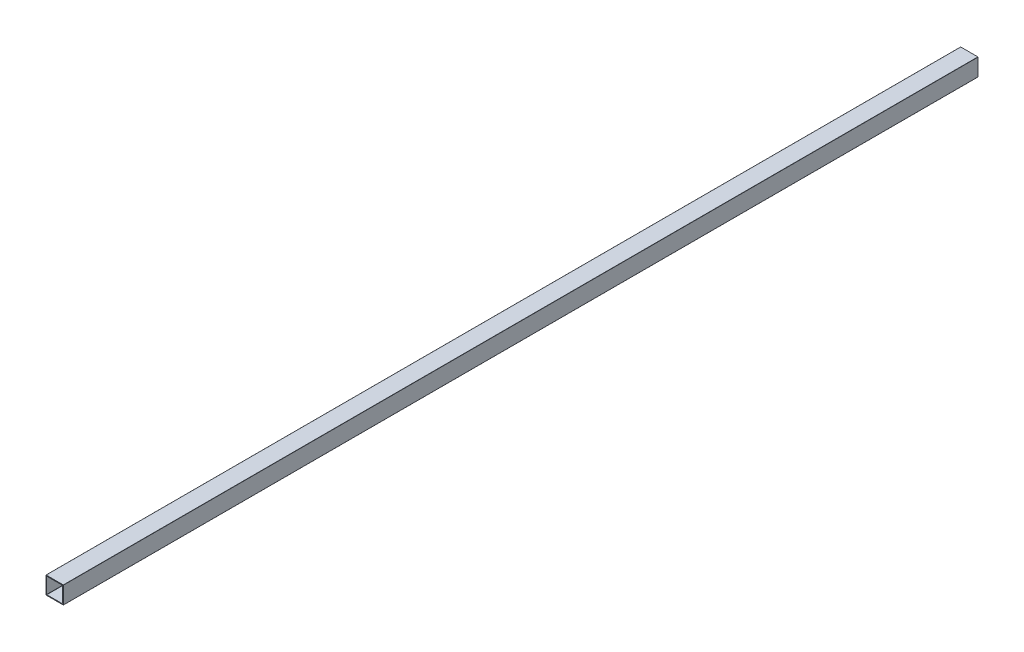
ISO-10303-21;
HEADER;
FILE_DESCRIPTION(('STEP AP214'),'2;1');
FILE_NAME('part.step','',(''),(''),'','','');
FILE_SCHEMA(('AUTOMOTIVE_DESIGN { 1 0 10303 214 1 1 1 1 }'));
ENDSEC;
DATA;
#1=APPLICATION_CONTEXT('core data for automotive mechanical design processes');
#2=APPLICATION_PROTOCOL_DEFINITION('international standard','automotive_design',2000,#1);
#3=PRODUCT_CONTEXT('',#1,'mechanical');
#4=PRODUCT('Part','Part','',(#3));
#5=PRODUCT_RELATED_PRODUCT_CATEGORY('part','',(#4));
#6=PRODUCT_DEFINITION_FORMATION('','',#4);
#7=PRODUCT_DEFINITION_CONTEXT('part definition',#1,'design');
#8=PRODUCT_DEFINITION('design','',#6,#7);
#9=PRODUCT_DEFINITION_SHAPE('','',#8);
#10=(LENGTH_UNIT() NAMED_UNIT(*) SI_UNIT(.MILLI.,.METRE.));
#11=(NAMED_UNIT(*) PLANE_ANGLE_UNIT() SI_UNIT($,.RADIAN.));
#12=(NAMED_UNIT(*) SI_UNIT($,.STERADIAN.) SOLID_ANGLE_UNIT());
#13=UNCERTAINTY_MEASURE_WITH_UNIT(LENGTH_MEASURE(1.E-05),#10,'distance_accuracy_value','');
#14=(GEOMETRIC_REPRESENTATION_CONTEXT(3) GLOBAL_UNCERTAINTY_ASSIGNED_CONTEXT((#13)) GLOBAL_UNIT_ASSIGNED_CONTEXT((#10,
#11,#12)) REPRESENTATION_CONTEXT('',''));
#15=CARTESIAN_POINT('',(0.,0.,0.));
#16=DIRECTION('',(0.,0.,1.));
#17=DIRECTION('',(1.,0.,0.));
#18=AXIS2_PLACEMENT_3D('',#15,#16,#17);
#19=CARTESIAN_POINT('',(57.15,-57.15,-6000.));
#20=DIRECTION('',(1.,0.,0.));
#21=DIRECTION('',(0.,0.,-1.));
#22=AXIS2_PLACEMENT_3D('',#19,#20,#21);
#23=PLANE('',#22);
#24=DIRECTION('',(0.,1.,0.));
#25=VECTOR('',#24,1.);
#26=CARTESIAN_POINT('',(57.15,-57.15,0.));
#27=LINE('',#26,#25);
#28=CARTESIAN_POINT('',(57.15,-56.15,0.));
#29=VERTEX_POINT('',#28);
#30=CARTESIAN_POINT('',(57.15,56.15,0.));
#31=VERTEX_POINT('',#30);
#32=EDGE_CURVE('E197',#29,#31,#27,.T.);
#33=ORIENTED_EDGE('',*,*,#32,.F.);
#34=DIRECTION('',(0.,0.,1.));
#35=VECTOR('',#34,1.);
#36=CARTESIAN_POINT('',(57.15,-56.15,-6000.));
#37=LINE('',#36,#35);
#38=CARTESIAN_POINT('',(57.15,-56.15,-6000.));
#39=VERTEX_POINT('',#38);
#40=EDGE_CURVE('E158',#29,#39,#37,.F.);
#41=ORIENTED_EDGE('',*,*,#40,.T.);
#42=DIRECTION('',(0.,1.,0.));
#43=VECTOR('',#42,1.);
#44=CARTESIAN_POINT('',(57.15,-57.15,-6000.));
#45=LINE('',#44,#43);
#46=CARTESIAN_POINT('',(57.15,56.15,-6000.));
#47=VERTEX_POINT('',#46);
#48=EDGE_CURVE('E185',#39,#47,#45,.T.);
#49=ORIENTED_EDGE('',*,*,#48,.T.);
#50=DIRECTION('',(0.,0.,1.));
#51=VECTOR('',#50,1.);
#52=CARTESIAN_POINT('',(57.15,56.15,-6000.));
#53=LINE('',#52,#51);
#54=EDGE_CURVE('E251',#47,#31,#53,.T.);
#55=ORIENTED_EDGE('',*,*,#54,.T.);
#56=EDGE_LOOP('',(#33,#41,#49,#55));
#57=FACE_BOUND('',#56,.T.);
#58=ADVANCED_FACE('F33',(#57),#23,.T.);
#59=CARTESIAN_POINT('',(-57.15,-57.15,-6000.));
#60=DIRECTION('',(0.,-1.,0.));
#61=DIRECTION('',(0.,0.,-1.));
#62=AXIS2_PLACEMENT_3D('',#59,#60,#61);
#63=PLANE('',#62);
#64=DIRECTION('',(1.,0.,0.));
#65=VECTOR('',#64,1.);
#66=CARTESIAN_POINT('',(-57.15,-57.15,0.));
#67=LINE('',#66,#65);
#68=CARTESIAN_POINT('',(-56.15,-57.15,0.));
#69=VERTEX_POINT('',#68);
#70=CARTESIAN_POINT('',(56.15,-57.15,0.));
#71=VERTEX_POINT('',#70);
#72=EDGE_CURVE('E189',#69,#71,#67,.T.);
#73=ORIENTED_EDGE('',*,*,#72,.F.);
#74=DIRECTION('',(0.,0.,1.));
#75=VECTOR('',#74,1.);
#76=CARTESIAN_POINT('',(-56.15,-57.15,-6000.));
#77=LINE('',#76,#75);
#78=CARTESIAN_POINT('',(-56.15,-57.15,-6000.));
#79=VERTEX_POINT('',#78);
#80=EDGE_CURVE('E238',#69,#79,#77,.F.);
#81=ORIENTED_EDGE('',*,*,#80,.T.);
#82=DIRECTION('',(1.,0.,0.));
#83=VECTOR('',#82,1.);
#84=CARTESIAN_POINT('',(-57.15,-57.15,-6000.));
#85=LINE('',#84,#83);
#86=CARTESIAN_POINT('',(56.15,-57.15,-6000.));
#87=VERTEX_POINT('',#86);
#88=EDGE_CURVE('E194',#79,#87,#85,.T.);
#89=ORIENTED_EDGE('',*,*,#88,.T.);
#90=DIRECTION('',(0.,0.,1.));
#91=VECTOR('',#90,1.);
#92=CARTESIAN_POINT('',(56.15,-57.15,-6000.));
#93=LINE('',#92,#91);
#94=EDGE_CURVE('E235',#87,#71,#93,.T.);
#95=ORIENTED_EDGE('',*,*,#94,.T.);
#96=EDGE_LOOP('',(#73,#81,#89,#95));
#97=FACE_BOUND('',#96,.T.);
#98=ADVANCED_FACE('F305',(#97),#63,.T.);
#99=CARTESIAN_POINT('',(-57.15,-57.15,-6000.));
#100=DIRECTION('',(-1.,0.,0.));
#101=DIRECTION('',(0.,0.,1.));
#102=AXIS2_PLACEMENT_3D('',#99,#100,#101);
#103=PLANE('',#102);
#104=DIRECTION('',(0.,-1.,0.));
#105=VECTOR('',#104,1.);
#106=CARTESIAN_POINT('',(-57.15,-57.15,-6000.));
#107=LINE('',#106,#105);
#108=CARTESIAN_POINT('',(-57.15,56.15,-6000.));
#109=VERTEX_POINT('',#108);
#110=CARTESIAN_POINT('',(-57.15,-56.15,-6000.));
#111=VERTEX_POINT('',#110);
#112=EDGE_CURVE('E191',#109,#111,#107,.T.);
#113=ORIENTED_EDGE('',*,*,#112,.T.);
#114=DIRECTION('',(0.,0.,1.));
#115=VECTOR('',#114,1.);
#116=CARTESIAN_POINT('',(-57.15,-56.15,-6000.));
#117=LINE('',#116,#115);
#118=CARTESIAN_POINT('',(-57.15,-56.15,0.));
#119=VERTEX_POINT('',#118);
#120=EDGE_CURVE('E224',#111,#119,#117,.T.);
#121=ORIENTED_EDGE('',*,*,#120,.T.);
#122=DIRECTION('',(0.,-1.,0.));
#123=VECTOR('',#122,1.);
#124=CARTESIAN_POINT('',(-57.15,-57.15,0.));
#125=LINE('',#124,#123);
#126=CARTESIAN_POINT('',(-57.15,56.15,0.));
#127=VERTEX_POINT('',#126);
#128=EDGE_CURVE('E203',#127,#119,#125,.T.);
#129=ORIENTED_EDGE('',*,*,#128,.F.);
#130=DIRECTION('',(0.,0.,1.));
#131=VECTOR('',#130,1.);
#132=CARTESIAN_POINT('',(-57.15,56.15,-6000.));
#133=LINE('',#132,#131);
#134=EDGE_CURVE('E222',#127,#109,#133,.F.);
#135=ORIENTED_EDGE('',*,*,#134,.T.);
#136=EDGE_LOOP('',(#113,#121,#129,#135));
#137=FACE_BOUND('',#136,.T.);
#138=ADVANCED_FACE('F311',(#137),#103,.T.);
#139=CARTESIAN_POINT('',(-57.15,57.15,-6000.));
#140=DIRECTION('',(0.,1.,0.));
#141=DIRECTION('',(0.,0.,1.));
#142=AXIS2_PLACEMENT_3D('',#139,#140,#141);
#143=PLANE('',#142);
#144=DIRECTION('',(-1.,0.,0.));
#145=VECTOR('',#144,1.);
#146=CARTESIAN_POINT('',(-57.15,57.15,-6000.));
#147=LINE('',#146,#145);
#148=CARTESIAN_POINT('',(56.15,57.15,-6000.));
#149=VERTEX_POINT('',#148);
#150=CARTESIAN_POINT('',(-56.15,57.15,-6000.));
#151=VERTEX_POINT('',#150);
#152=EDGE_CURVE('E188',#149,#151,#147,.T.);
#153=ORIENTED_EDGE('',*,*,#152,.T.);
#154=DIRECTION('',(0.,0.,1.));
#155=VECTOR('',#154,1.);
#156=CARTESIAN_POINT('',(-56.15,57.15,-6000.));
#157=LINE('',#156,#155);
#158=CARTESIAN_POINT('',(-56.15,57.15,0.));
#159=VERTEX_POINT('',#158);
#160=EDGE_CURVE('E248',#151,#159,#157,.T.);
#161=ORIENTED_EDGE('',*,*,#160,.T.);
#162=DIRECTION('',(-1.,0.,0.));
#163=VECTOR('',#162,1.);
#164=CARTESIAN_POINT('',(-57.15,57.15,0.));
#165=LINE('',#164,#163);
#166=CARTESIAN_POINT('',(56.15,57.15,0.));
#167=VERTEX_POINT('',#166);
#168=EDGE_CURVE('E200',#167,#159,#165,.T.);
#169=ORIENTED_EDGE('',*,*,#168,.F.);
#170=DIRECTION('',(0.,0.,1.));
#171=VECTOR('',#170,1.);
#172=CARTESIAN_POINT('',(56.15,57.15,-6000.));
#173=LINE('',#172,#171);
#174=EDGE_CURVE('E55',#167,#149,#173,.F.);
#175=ORIENTED_EDGE('',*,*,#174,.T.);
#176=EDGE_LOOP('',(#153,#161,#169,#175));
#177=FACE_BOUND('',#176,.T.);
#178=ADVANCED_FACE('F316',(#177),#143,.T.);
#179=CARTESIAN_POINT('',(0.,0.,-6000.));
#180=DIRECTION('',(0.,0.,-1.));
#181=DIRECTION('',(-1.,0.,0.));
#182=AXIS2_PLACEMENT_3D('',#179,#180,#181);
#183=PLANE('',#182);
#184=DIRECTION('',(0.,-1.,0.));
#185=VECTOR('',#184,1.);
#186=CARTESIAN_POINT('',(-52.6,-52.6,-6000.));
#187=LINE('',#186,#185);
#188=CARTESIAN_POINT('',(-52.6,51.6,-6000.));
#189=VERTEX_POINT('',#188);
#190=CARTESIAN_POINT('',(-52.6,-51.6,-6000.));
#191=VERTEX_POINT('',#190);
#192=EDGE_CURVE('E167',#189,#191,#187,.T.);
#193=ORIENTED_EDGE('',*,*,#192,.T.);
#194=CARTESIAN_POINT('',(-51.6,-51.6,-6000.));
#195=DIRECTION('',(0.,0.,-1.));
#196=DIRECTION('',(-1.,0.,0.));
#197=AXIS2_PLACEMENT_3D('',#194,#195,#196);
#198=CIRCLE('',#197,1.);
#199=CARTESIAN_POINT('',(-51.6,-52.6,-6000.));
#200=VERTEX_POINT('',#199);
#201=EDGE_CURVE('E11',#191,#200,#198,.F.);
#202=ORIENTED_EDGE('',*,*,#201,.T.);
#203=DIRECTION('',(1.,0.,0.));
#204=VECTOR('',#203,1.);
#205=CARTESIAN_POINT('',(-52.6,-52.6,-6000.));
#206=LINE('',#205,#204);
#207=CARTESIAN_POINT('',(51.6,-52.6,-6000.));
#208=VERTEX_POINT('',#207);
#209=EDGE_CURVE('E175',#200,#208,#206,.T.);
#210=ORIENTED_EDGE('',*,*,#209,.T.);
#211=CARTESIAN_POINT('',(51.6,-51.6,-6000.));
#212=DIRECTION('',(0.,0.,-1.));
#213=DIRECTION('',(-1.,0.,0.));
#214=AXIS2_PLACEMENT_3D('',#211,#212,#213);
#215=CIRCLE('',#214,1.);
#216=CARTESIAN_POINT('',(52.6,-51.6,-6000.));
#217=VERTEX_POINT('',#216);
#218=EDGE_CURVE('E262',#208,#217,#215,.F.);
#219=ORIENTED_EDGE('',*,*,#218,.T.);
#220=DIRECTION('',(0.,1.,0.));
#221=VECTOR('',#220,1.);
#222=CARTESIAN_POINT('',(52.6,-52.6,-6000.));
#223=LINE('',#222,#221);
#224=CARTESIAN_POINT('',(52.6,51.6,-6000.));
#225=VERTEX_POINT('',#224);
#226=EDGE_CURVE('E179',#217,#225,#223,.T.);
#227=ORIENTED_EDGE('',*,*,#226,.T.);
#228=CARTESIAN_POINT('',(51.6,51.6,-6000.));
#229=DIRECTION('',(0.,0.,-1.));
#230=DIRECTION('',(-1.,0.,0.));
#231=AXIS2_PLACEMENT_3D('',#228,#229,#230);
#232=CIRCLE('',#231,1.);
#233=CARTESIAN_POINT('',(51.6,52.6,-6000.));
#234=VERTEX_POINT('',#233);
#235=EDGE_CURVE('E258',#225,#234,#232,.F.);
#236=ORIENTED_EDGE('',*,*,#235,.T.);
#237=DIRECTION('',(-1.,0.,0.));
#238=VECTOR('',#237,1.);
#239=CARTESIAN_POINT('',(-52.6,52.6,-6000.));
#240=LINE('',#239,#238);
#241=CARTESIAN_POINT('',(-51.6,52.6,-6000.));
#242=VERTEX_POINT('',#241);
#243=EDGE_CURVE('E277',#234,#242,#240,.T.);
#244=ORIENTED_EDGE('',*,*,#243,.T.);
#245=CARTESIAN_POINT('',(-51.6,51.6,-6000.));
#246=DIRECTION('',(0.,0.,-1.));
#247=DIRECTION('',(-1.,0.,0.));
#248=AXIS2_PLACEMENT_3D('',#245,#246,#247);
#249=CIRCLE('',#248,1.);
#250=EDGE_CURVE('E157',#242,#189,#249,.F.);
#251=ORIENTED_EDGE('',*,*,#250,.T.);
#252=EDGE_LOOP('',(#193,#202,#210,#219,#227,#236,#244,#251));
#253=FACE_BOUND('',#252,.T.);
#254=ORIENTED_EDGE('',*,*,#88,.F.);
#255=CARTESIAN_POINT('',(-56.15,-56.15,-6000.));
#256=DIRECTION('',(0.,0.,-1.));
#257=DIRECTION('',(-1.,0.,0.));
#258=AXIS2_PLACEMENT_3D('',#255,#256,#257);
#259=CIRCLE('',#258,1.);
#260=EDGE_CURVE('E245',#79,#111,#259,.T.);
#261=ORIENTED_EDGE('',*,*,#260,.T.);
#262=ORIENTED_EDGE('',*,*,#112,.F.);
#263=CARTESIAN_POINT('',(-56.15,56.15,-6000.));
#264=DIRECTION('',(0.,0.,-1.));
#265=DIRECTION('',(-1.,0.,0.));
#266=AXIS2_PLACEMENT_3D('',#263,#264,#265);
#267=CIRCLE('',#266,1.);
#268=EDGE_CURVE('E48',#109,#151,#267,.T.);
#269=ORIENTED_EDGE('',*,*,#268,.T.);
#270=ORIENTED_EDGE('',*,*,#152,.F.);
#271=CARTESIAN_POINT('',(56.15,56.15,-6000.));
#272=DIRECTION('',(0.,0.,-1.));
#273=DIRECTION('',(-1.,0.,0.));
#274=AXIS2_PLACEMENT_3D('',#271,#272,#273);
#275=CIRCLE('',#274,1.);
#276=EDGE_CURVE('E240',#149,#47,#275,.T.);
#277=ORIENTED_EDGE('',*,*,#276,.T.);
#278=ORIENTED_EDGE('',*,*,#48,.F.);
#279=CARTESIAN_POINT('',(56.15,-56.15,-6000.));
#280=DIRECTION('',(0.,0.,-1.));
#281=DIRECTION('',(-1.,0.,0.));
#282=AXIS2_PLACEMENT_3D('',#279,#280,#281);
#283=CIRCLE('',#282,1.);
#284=EDGE_CURVE('E242',#39,#87,#283,.T.);
#285=ORIENTED_EDGE('',*,*,#284,.T.);
#286=EDGE_LOOP('',(#254,#261,#262,#269,#270,#277,#278,#285));
#287=FACE_BOUND('',#286,.T.);
#288=ADVANCED_FACE('F267',(#253,#287),#183,.T.);
#289=CARTESIAN_POINT('',(0.,0.,0.));
#290=DIRECTION('',(0.,0.,-1.));
#291=DIRECTION('',(-1.,0.,0.));
#292=AXIS2_PLACEMENT_3D('',#289,#290,#291);
#293=PLANE('',#292);
#294=DIRECTION('',(0.,1.,0.));
#295=VECTOR('',#294,1.);
#296=CARTESIAN_POINT('',(52.6,-52.6,0.));
#297=LINE('',#296,#295);
#298=CARTESIAN_POINT('',(52.6,-51.6,0.));
#299=VERTEX_POINT('',#298);
#300=CARTESIAN_POINT('',(52.6,51.6,0.));
#301=VERTEX_POINT('',#300);
#302=EDGE_CURVE('E181',#299,#301,#297,.T.);
#303=ORIENTED_EDGE('',*,*,#302,.F.);
#304=CARTESIAN_POINT('',(51.6,-51.6,0.));
#305=DIRECTION('',(0.,0.,-1.));
#306=DIRECTION('',(-1.,0.,0.));
#307=AXIS2_PLACEMENT_3D('',#304,#305,#306);
#308=CIRCLE('',#307,1.);
#309=CARTESIAN_POINT('',(51.6,-52.6,0.));
#310=VERTEX_POINT('',#309);
#311=EDGE_CURVE('E260',#299,#310,#308,.T.);
#312=ORIENTED_EDGE('',*,*,#311,.T.);
#313=DIRECTION('',(1.,0.,0.));
#314=VECTOR('',#313,1.);
#315=CARTESIAN_POINT('',(-52.6,-52.6,0.));
#316=LINE('',#315,#314);
#317=CARTESIAN_POINT('',(-51.6,-52.6,0.));
#318=VERTEX_POINT('',#317);
#319=EDGE_CURVE('E281',#318,#310,#316,.T.);
#320=ORIENTED_EDGE('',*,*,#319,.F.);
#321=CARTESIAN_POINT('',(-51.6,-51.6,0.));
#322=DIRECTION('',(0.,0.,-1.));
#323=DIRECTION('',(-1.,0.,0.));
#324=AXIS2_PLACEMENT_3D('',#321,#322,#323);
#325=CIRCLE('',#324,1.);
#326=CARTESIAN_POINT('',(-52.6,-51.6,0.));
#327=VERTEX_POINT('',#326);
#328=EDGE_CURVE('E41',#318,#327,#325,.T.);
#329=ORIENTED_EDGE('',*,*,#328,.T.);
#330=DIRECTION('',(0.,-1.,0.));
#331=VECTOR('',#330,1.);
#332=CARTESIAN_POINT('',(-52.6,-52.6,0.));
#333=LINE('',#332,#331);
#334=CARTESIAN_POINT('',(-52.6,51.6,0.));
#335=VERTEX_POINT('',#334);
#336=EDGE_CURVE('E164',#335,#327,#333,.T.);
#337=ORIENTED_EDGE('',*,*,#336,.F.);
#338=CARTESIAN_POINT('',(-51.6,51.6,0.));
#339=DIRECTION('',(0.,0.,-1.));
#340=DIRECTION('',(-1.,0.,0.));
#341=AXIS2_PLACEMENT_3D('',#338,#339,#340);
#342=CIRCLE('',#341,1.);
#343=CARTESIAN_POINT('',(-51.6,52.6,0.));
#344=VERTEX_POINT('',#343);
#345=EDGE_CURVE('E147',#335,#344,#342,.T.);
#346=ORIENTED_EDGE('',*,*,#345,.T.);
#347=DIRECTION('',(-1.,0.,0.));
#348=VECTOR('',#347,1.);
#349=CARTESIAN_POINT('',(-52.6,52.6,0.));
#350=LINE('',#349,#348);
#351=CARTESIAN_POINT('',(51.6,52.6,0.));
#352=VERTEX_POINT('',#351);
#353=EDGE_CURVE('E176',#352,#344,#350,.T.);
#354=ORIENTED_EDGE('',*,*,#353,.F.);
#355=CARTESIAN_POINT('',(51.6,51.6,0.));
#356=DIRECTION('',(0.,0.,-1.));
#357=DIRECTION('',(-1.,0.,0.));
#358=AXIS2_PLACEMENT_3D('',#355,#356,#357);
#359=CIRCLE('',#358,1.);
#360=EDGE_CURVE('E256',#352,#301,#359,.T.);
#361=ORIENTED_EDGE('',*,*,#360,.T.);
#362=EDGE_LOOP('',(#303,#312,#320,#329,#337,#346,#354,#361));
#363=FACE_BOUND('',#362,.T.);
#364=ORIENTED_EDGE('',*,*,#128,.T.);
#365=CARTESIAN_POINT('',(-56.15,-56.15,0.));
#366=DIRECTION('',(0.,0.,-1.));
#367=DIRECTION('',(-1.,0.,0.));
#368=AXIS2_PLACEMENT_3D('',#365,#366,#367);
#369=CIRCLE('',#368,1.);
#370=EDGE_CURVE('E233',#119,#69,#369,.F.);
#371=ORIENTED_EDGE('',*,*,#370,.T.);
#372=ORIENTED_EDGE('',*,*,#72,.T.);
#373=CARTESIAN_POINT('',(56.15,-56.15,0.));
#374=DIRECTION('',(0.,0.,-1.));
#375=DIRECTION('',(-1.,0.,0.));
#376=AXIS2_PLACEMENT_3D('',#373,#374,#375);
#377=CIRCLE('',#376,1.);
#378=EDGE_CURVE('E229',#71,#29,#377,.F.);
#379=ORIENTED_EDGE('',*,*,#378,.T.);
#380=ORIENTED_EDGE('',*,*,#32,.T.);
#381=CARTESIAN_POINT('',(56.15,56.15,0.));
#382=DIRECTION('',(0.,0.,-1.));
#383=DIRECTION('',(-1.,0.,0.));
#384=AXIS2_PLACEMENT_3D('',#381,#382,#383);
#385=CIRCLE('',#384,1.);
#386=EDGE_CURVE('E227',#31,#167,#385,.F.);
#387=ORIENTED_EDGE('',*,*,#386,.T.);
#388=ORIENTED_EDGE('',*,*,#168,.T.);
#389=CARTESIAN_POINT('',(-56.15,56.15,0.));
#390=DIRECTION('',(0.,0.,-1.));
#391=DIRECTION('',(-1.,0.,0.));
#392=AXIS2_PLACEMENT_3D('',#389,#390,#391);
#393=CIRCLE('',#392,1.);
#394=EDGE_CURVE('E231',#159,#127,#393,.F.);
#395=ORIENTED_EDGE('',*,*,#394,.T.);
#396=EDGE_LOOP('',(#364,#371,#372,#379,#380,#387,#388,#395));
#397=FACE_BOUND('',#396,.T.);
#398=ADVANCED_FACE('F172',(#363,#397),#293,.F.);
#399=CARTESIAN_POINT('',(-52.6,-52.6,-6000.));
#400=DIRECTION('',(0.,-1.,0.));
#401=DIRECTION('',(0.,0.,-1.));
#402=AXIS2_PLACEMENT_3D('',#399,#400,#401);
#403=PLANE('',#402);
#404=ORIENTED_EDGE('',*,*,#319,.T.);
#405=DIRECTION('',(0.,0.,1.));
#406=VECTOR('',#405,1.);
#407=CARTESIAN_POINT('',(51.6,-52.6,-6000.));
#408=LINE('',#407,#406);
#409=EDGE_CURVE('E220',#310,#208,#408,.F.);
#410=ORIENTED_EDGE('',*,*,#409,.T.);
#411=ORIENTED_EDGE('',*,*,#209,.F.);
#412=DIRECTION('',(0.,0.,1.));
#413=VECTOR('',#412,1.);
#414=CARTESIAN_POINT('',(-51.6,-52.6,0.));
#415=LINE('',#414,#413);
#416=EDGE_CURVE('E217',#200,#318,#415,.T.);
#417=ORIENTED_EDGE('',*,*,#416,.T.);
#418=EDGE_LOOP('',(#404,#410,#411,#417));
#419=FACE_BOUND('',#418,.T.);
#420=ADVANCED_FACE('F283',(#419),#403,.F.);
#421=CARTESIAN_POINT('',(-52.6,-52.6,-6000.));
#422=DIRECTION('',(-1.,0.,0.));
#423=DIRECTION('',(0.,0.,1.));
#424=AXIS2_PLACEMENT_3D('',#421,#422,#423);
#425=PLANE('',#424);
#426=ORIENTED_EDGE('',*,*,#192,.F.);
#427=DIRECTION('',(0.,0.,1.));
#428=VECTOR('',#427,1.);
#429=CARTESIAN_POINT('',(-52.6,51.6,0.));
#430=LINE('',#429,#428);
#431=EDGE_CURVE('E151',#189,#335,#430,.T.);
#432=ORIENTED_EDGE('',*,*,#431,.T.);
#433=ORIENTED_EDGE('',*,*,#336,.T.);
#434=DIRECTION('',(0.,0.,1.));
#435=VECTOR('',#434,1.);
#436=CARTESIAN_POINT('',(-52.6,-51.6,-6000.));
#437=LINE('',#436,#435);
#438=EDGE_CURVE('E169',#327,#191,#437,.F.);
#439=ORIENTED_EDGE('',*,*,#438,.T.);
#440=EDGE_LOOP('',(#426,#432,#433,#439));
#441=FACE_BOUND('',#440,.T.);
#442=ADVANCED_FACE('F163',(#441),#425,.F.);
#443=CARTESIAN_POINT('',(-52.6,52.6,-6000.));
#444=DIRECTION('',(0.,1.,0.));
#445=DIRECTION('',(0.,0.,1.));
#446=AXIS2_PLACEMENT_3D('',#443,#444,#445);
#447=PLANE('',#446);
#448=ORIENTED_EDGE('',*,*,#353,.T.);
#449=DIRECTION('',(0.,0.,1.));
#450=VECTOR('',#449,1.);
#451=CARTESIAN_POINT('',(-51.6,52.6,-6000.));
#452=LINE('',#451,#450);
#453=EDGE_CURVE('E152',#344,#242,#452,.F.);
#454=ORIENTED_EDGE('',*,*,#453,.T.);
#455=ORIENTED_EDGE('',*,*,#243,.F.);
#456=DIRECTION('',(0.,0.,1.));
#457=VECTOR('',#456,1.);
#458=CARTESIAN_POINT('',(51.6,52.6,0.));
#459=LINE('',#458,#457);
#460=EDGE_CURVE('E168',#234,#352,#459,.T.);
#461=ORIENTED_EDGE('',*,*,#460,.T.);
#462=EDGE_LOOP('',(#448,#454,#455,#461));
#463=FACE_BOUND('',#462,.T.);
#464=ADVANCED_FACE('F292',(#463),#447,.F.);
#465=CARTESIAN_POINT('',(52.6,-52.6,-6000.));
#466=DIRECTION('',(1.,0.,0.));
#467=DIRECTION('',(0.,0.,-1.));
#468=AXIS2_PLACEMENT_3D('',#465,#466,#467);
#469=PLANE('',#468);
#470=ORIENTED_EDGE('',*,*,#302,.T.);
#471=DIRECTION('',(0.,0.,1.));
#472=VECTOR('',#471,1.);
#473=CARTESIAN_POINT('',(52.6,51.6,-6000.));
#474=LINE('',#473,#472);
#475=EDGE_CURVE('E215',#301,#225,#474,.F.);
#476=ORIENTED_EDGE('',*,*,#475,.T.);
#477=ORIENTED_EDGE('',*,*,#226,.F.);
#478=DIRECTION('',(0.,0.,1.));
#479=VECTOR('',#478,1.);
#480=CARTESIAN_POINT('',(52.6,-51.6,0.));
#481=LINE('',#480,#479);
#482=EDGE_CURVE('E212',#217,#299,#481,.T.);
#483=ORIENTED_EDGE('',*,*,#482,.T.);
#484=EDGE_LOOP('',(#470,#476,#477,#483));
#485=FACE_BOUND('',#484,.T.);
#486=ADVANCED_FACE('F275',(#485),#469,.F.);
#487=CARTESIAN_POINT('',(-51.6,51.6,-6000.));
#488=DIRECTION('',(0.,0.,-1.));
#489=DIRECTION('',(-1.,0.,0.));
#490=AXIS2_PLACEMENT_3D('',#487,#488,#489);
#491=CYLINDRICAL_SURFACE('',#490,1.);
#492=ORIENTED_EDGE('',*,*,#250,.F.);
#493=ORIENTED_EDGE('',*,*,#453,.F.);
#494=ORIENTED_EDGE('',*,*,#345,.F.);
#495=ORIENTED_EDGE('',*,*,#431,.F.);
#496=EDGE_LOOP('',(#492,#493,#494,#495));
#497=FACE_BOUND('',#496,.T.);
#498=ADVANCED_FACE('F150',(#497),#491,.F.);
#499=CARTESIAN_POINT('',(51.6,51.6,-6000.));
#500=DIRECTION('',(0.,0.,-1.));
#501=DIRECTION('',(-1.,0.,0.));
#502=AXIS2_PLACEMENT_3D('',#499,#500,#501);
#503=CYLINDRICAL_SURFACE('',#502,1.);
#504=ORIENTED_EDGE('',*,*,#235,.F.);
#505=ORIENTED_EDGE('',*,*,#475,.F.);
#506=ORIENTED_EDGE('',*,*,#360,.F.);
#507=ORIENTED_EDGE('',*,*,#460,.F.);
#508=EDGE_LOOP('',(#504,#505,#506,#507));
#509=FACE_BOUND('',#508,.T.);
#510=ADVANCED_FACE('F294',(#509),#503,.F.);
#511=CARTESIAN_POINT('',(51.6,-51.6,-6000.));
#512=DIRECTION('',(0.,0.,-1.));
#513=DIRECTION('',(-1.,0.,0.));
#514=AXIS2_PLACEMENT_3D('',#511,#512,#513);
#515=CYLINDRICAL_SURFACE('',#514,1.);
#516=ORIENTED_EDGE('',*,*,#218,.F.);
#517=ORIENTED_EDGE('',*,*,#409,.F.);
#518=ORIENTED_EDGE('',*,*,#311,.F.);
#519=ORIENTED_EDGE('',*,*,#482,.F.);
#520=EDGE_LOOP('',(#516,#517,#518,#519));
#521=FACE_BOUND('',#520,.T.);
#522=ADVANCED_FACE('F279',(#521),#515,.F.);
#523=CARTESIAN_POINT('',(-56.15,-56.15,-6000.));
#524=DIRECTION('',(0.,0.,1.));
#525=DIRECTION('',(1.,0.,0.));
#526=AXIS2_PLACEMENT_3D('',#523,#524,#525);
#527=CYLINDRICAL_SURFACE('',#526,1.);
#528=ORIENTED_EDGE('',*,*,#260,.F.);
#529=ORIENTED_EDGE('',*,*,#80,.F.);
#530=ORIENTED_EDGE('',*,*,#370,.F.);
#531=ORIENTED_EDGE('',*,*,#120,.F.);
#532=EDGE_LOOP('',(#528,#529,#530,#531));
#533=FACE_BOUND('',#532,.T.);
#534=ADVANCED_FACE('F301',(#533),#527,.T.);
#535=CARTESIAN_POINT('',(-56.15,56.15,-6000.));
#536=DIRECTION('',(0.,0.,1.));
#537=DIRECTION('',(1.,0.,0.));
#538=AXIS2_PLACEMENT_3D('',#535,#536,#537);
#539=CYLINDRICAL_SURFACE('',#538,1.);
#540=ORIENTED_EDGE('',*,*,#268,.F.);
#541=ORIENTED_EDGE('',*,*,#134,.F.);
#542=ORIENTED_EDGE('',*,*,#394,.F.);
#543=ORIENTED_EDGE('',*,*,#160,.F.);
#544=EDGE_LOOP('',(#540,#541,#542,#543));
#545=FACE_BOUND('',#544,.T.);
#546=ADVANCED_FACE('F368',(#545),#539,.T.);
#547=CARTESIAN_POINT('',(-51.6,-51.6,-6000.));
#548=DIRECTION('',(0.,0.,-1.));
#549=DIRECTION('',(-1.,0.,0.));
#550=AXIS2_PLACEMENT_3D('',#547,#548,#549);
#551=CYLINDRICAL_SURFACE('',#550,1.);
#552=ORIENTED_EDGE('',*,*,#201,.F.);
#553=ORIENTED_EDGE('',*,*,#438,.F.);
#554=ORIENTED_EDGE('',*,*,#328,.F.);
#555=ORIENTED_EDGE('',*,*,#416,.F.);
#556=EDGE_LOOP('',(#552,#553,#554,#555));
#557=FACE_BOUND('',#556,.T.);
#558=ADVANCED_FACE('F378',(#557),#551,.F.);
#559=CARTESIAN_POINT('',(56.15,-56.15,-6000.));
#560=DIRECTION('',(0.,0.,1.));
#561=DIRECTION('',(1.,0.,0.));
#562=AXIS2_PLACEMENT_3D('',#559,#560,#561);
#563=CYLINDRICAL_SURFACE('',#562,1.);
#564=ORIENTED_EDGE('',*,*,#284,.F.);
#565=ORIENTED_EDGE('',*,*,#40,.F.);
#566=ORIENTED_EDGE('',*,*,#378,.F.);
#567=ORIENTED_EDGE('',*,*,#94,.F.);
#568=EDGE_LOOP('',(#564,#565,#566,#567));
#569=FACE_BOUND('',#568,.T.);
#570=ADVANCED_FACE('F388',(#569),#563,.T.);
#571=CARTESIAN_POINT('',(56.15,56.15,-6000.));
#572=DIRECTION('',(0.,0.,1.));
#573=DIRECTION('',(1.,0.,0.));
#574=AXIS2_PLACEMENT_3D('',#571,#572,#573);
#575=CYLINDRICAL_SURFACE('',#574,1.);
#576=ORIENTED_EDGE('',*,*,#276,.F.);
#577=ORIENTED_EDGE('',*,*,#174,.F.);
#578=ORIENTED_EDGE('',*,*,#386,.F.);
#579=ORIENTED_EDGE('',*,*,#54,.F.);
#580=EDGE_LOOP('',(#576,#577,#578,#579));
#581=FACE_BOUND('',#580,.T.);
#582=ADVANCED_FACE('F35',(#581),#575,.T.);
#583=CLOSED_SHELL('',(#58,#98,#138,#178,#288,#398,#420,#442,#464,#486,#498,#510,#522,#534,#546,
#558,#570,#582));
#584=MANIFOLD_SOLID_BREP('B2',#583);
#585=ADVANCED_BREP_SHAPE_REPRESENTATION('',(#18,#584),#14);
#586=SHAPE_DEFINITION_REPRESENTATION(#9,#585);
ENDSEC;
END-ISO-10303-21;
